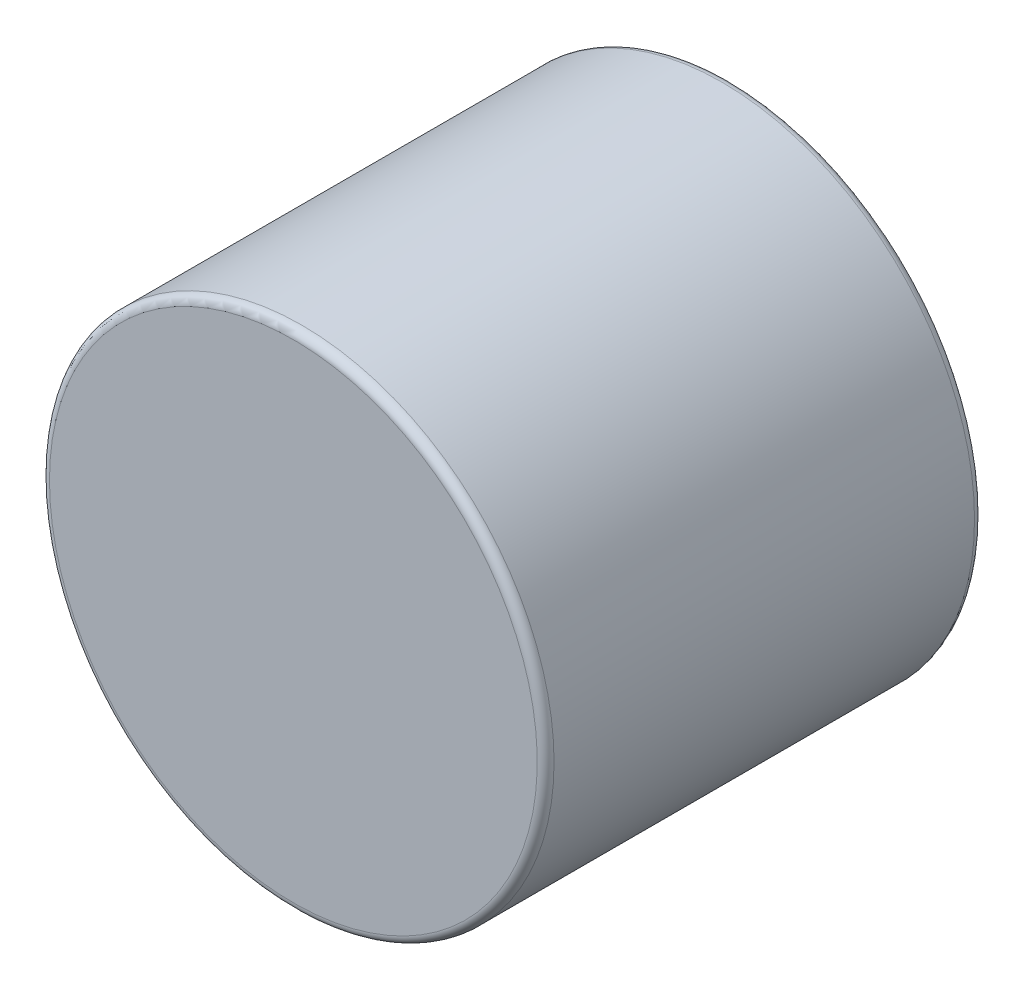
ISO-10303-21;
HEADER;
FILE_DESCRIPTION(('STEP AP214'),'2;1');
FILE_NAME('part.step','',(''),(''),'','','');
FILE_SCHEMA(('AUTOMOTIVE_DESIGN { 1 0 10303 214 1 1 1 1 }'));
ENDSEC;
DATA;
#1=APPLICATION_CONTEXT('core data for automotive mechanical design processes');
#2=APPLICATION_PROTOCOL_DEFINITION('international standard','automotive_design',2000,#1);
#3=PRODUCT_CONTEXT('',#1,'mechanical');
#4=PRODUCT('Part','Part','',(#3));
#5=PRODUCT_RELATED_PRODUCT_CATEGORY('part','',(#4));
#6=PRODUCT_DEFINITION_FORMATION('','',#4);
#7=PRODUCT_DEFINITION_CONTEXT('part definition',#1,'design');
#8=PRODUCT_DEFINITION('design','',#6,#7);
#9=PRODUCT_DEFINITION_SHAPE('','',#8);
#10=(LENGTH_UNIT() NAMED_UNIT(*) SI_UNIT(.MILLI.,.METRE.));
#11=(NAMED_UNIT(*) PLANE_ANGLE_UNIT() SI_UNIT($,.RADIAN.));
#12=(NAMED_UNIT(*) SI_UNIT($,.STERADIAN.) SOLID_ANGLE_UNIT());
#13=UNCERTAINTY_MEASURE_WITH_UNIT(LENGTH_MEASURE(1.E-05),#10,'distance_accuracy_value','');
#14=(GEOMETRIC_REPRESENTATION_CONTEXT(3) GLOBAL_UNCERTAINTY_ASSIGNED_CONTEXT((#13)) GLOBAL_UNIT_ASSIGNED_CONTEXT((#10,
#11,#12)) REPRESENTATION_CONTEXT('',''));
#15=CARTESIAN_POINT('',(0.,0.,0.));
#16=DIRECTION('',(0.,0.,1.));
#17=DIRECTION('',(1.,0.,0.));
#18=AXIS2_PLACEMENT_3D('',#15,#16,#17);
#19=CARTESIAN_POINT('',(228.6,-285.75,228.6));
#20=DIRECTION('',(-1.,0.,0.));
#21=DIRECTION('',(0.,0.,1.));
#22=AXIS2_PLACEMENT_3D('',#19,#20,#21);
#23=PLANE('',#22);
#24=DIRECTION('',(0.,0.,-1.));
#25=VECTOR('',#24,1.);
#26=CARTESIAN_POINT('',(228.6,-292.1,228.6));
#27=LINE('',#26,#25);
#28=CARTESIAN_POINT('',(228.6,-292.1,228.6));
#29=VERTEX_POINT('',#28);
#30=CARTESIAN_POINT('',(228.6,-292.1,-228.6));
#31=VERTEX_POINT('',#30);
#32=EDGE_CURVE('E109',#29,#31,#27,.T.);
#33=ORIENTED_EDGE('',*,*,#32,.T.);
#34=DIRECTION('',(0.,-1.,0.));
#35=VECTOR('',#34,1.);
#36=CARTESIAN_POINT('',(228.6,-285.75,-228.6));
#37=LINE('',#36,#35);
#38=CARTESIAN_POINT('',(228.6,-285.75,-228.6));
#39=VERTEX_POINT('',#38);
#40=EDGE_CURVE('E12',#39,#31,#37,.T.);
#41=ORIENTED_EDGE('',*,*,#40,.F.);
#42=DIRECTION('',(0.,0.,-1.));
#43=VECTOR('',#42,1.);
#44=CARTESIAN_POINT('',(228.6,-285.75,228.6));
#45=LINE('',#44,#43);
#46=CARTESIAN_POINT('',(228.6,-285.75,228.6));
#47=VERTEX_POINT('',#46);
#48=EDGE_CURVE('E97',#47,#39,#45,.T.);
#49=ORIENTED_EDGE('',*,*,#48,.F.);
#50=DIRECTION('',(0.,-1.,0.));
#51=VECTOR('',#50,1.);
#52=CARTESIAN_POINT('',(228.6,-285.75,228.6));
#53=LINE('',#52,#51);
#54=EDGE_CURVE('E105',#47,#29,#53,.T.);
#55=ORIENTED_EDGE('',*,*,#54,.T.);
#56=EDGE_LOOP('',(#33,#41,#49,#55));
#57=FACE_BOUND('',#56,.T.);
#58=ADVANCED_FACE('F46',(#57),#23,.F.);
#59=CARTESIAN_POINT('',(-228.6,-285.75,-228.6));
#60=DIRECTION('',(0.,0.,1.));
#61=DIRECTION('',(1.,0.,0.));
#62=AXIS2_PLACEMENT_3D('',#59,#60,#61);
#63=PLANE('',#62);
#64=DIRECTION('',(-1.,0.,0.));
#65=VECTOR('',#64,1.);
#66=CARTESIAN_POINT('',(-228.6,-292.1,-228.6));
#67=LINE('',#66,#65);
#68=CARTESIAN_POINT('',(-228.6,-292.1,-228.6));
#69=VERTEX_POINT('',#68);
#70=EDGE_CURVE('E101',#31,#69,#67,.T.);
#71=ORIENTED_EDGE('',*,*,#70,.T.);
#72=DIRECTION('',(0.,-1.,0.));
#73=VECTOR('',#72,1.);
#74=CARTESIAN_POINT('',(-228.6,-285.75,-228.6));
#75=LINE('',#74,#73);
#76=CARTESIAN_POINT('',(-228.6,-285.75,-228.6));
#77=VERTEX_POINT('',#76);
#78=EDGE_CURVE('E54',#77,#69,#75,.T.);
#79=ORIENTED_EDGE('',*,*,#78,.F.);
#80=DIRECTION('',(-1.,0.,0.));
#81=VECTOR('',#80,1.);
#82=CARTESIAN_POINT('',(-228.6,-285.75,-228.6));
#83=LINE('',#82,#81);
#84=EDGE_CURVE('E92',#39,#77,#83,.T.);
#85=ORIENTED_EDGE('',*,*,#84,.F.);
#86=ORIENTED_EDGE('',*,*,#40,.T.);
#87=EDGE_LOOP('',(#71,#79,#85,#86));
#88=FACE_BOUND('',#87,.T.);
#89=ADVANCED_FACE('F100',(#88),#63,.F.);
#90=CARTESIAN_POINT('',(-228.6,-285.75,228.6));
#91=DIRECTION('',(1.,0.,0.));
#92=DIRECTION('',(0.,0.,-1.));
#93=AXIS2_PLACEMENT_3D('',#90,#91,#92);
#94=PLANE('',#93);
#95=DIRECTION('',(0.,0.,1.));
#96=VECTOR('',#95,1.);
#97=CARTESIAN_POINT('',(-228.6,-292.1,228.6));
#98=LINE('',#97,#96);
#99=CARTESIAN_POINT('',(-228.6,-292.1,228.6));
#100=VERTEX_POINT('',#99);
#101=EDGE_CURVE('E79',#69,#100,#98,.T.);
#102=ORIENTED_EDGE('',*,*,#101,.T.);
#103=DIRECTION('',(0.,-1.,0.));
#104=VECTOR('',#103,1.);
#105=CARTESIAN_POINT('',(-228.6,-285.75,228.6));
#106=LINE('',#105,#104);
#107=CARTESIAN_POINT('',(-228.6,-285.75,228.6));
#108=VERTEX_POINT('',#107);
#109=EDGE_CURVE('E102',#108,#100,#106,.T.);
#110=ORIENTED_EDGE('',*,*,#109,.F.);
#111=DIRECTION('',(0.,0.,1.));
#112=VECTOR('',#111,1.);
#113=CARTESIAN_POINT('',(-228.6,-285.75,228.6));
#114=LINE('',#113,#112);
#115=EDGE_CURVE('E95',#77,#108,#114,.T.);
#116=ORIENTED_EDGE('',*,*,#115,.F.);
#117=ORIENTED_EDGE('',*,*,#78,.T.);
#118=EDGE_LOOP('',(#102,#110,#116,#117));
#119=FACE_BOUND('',#118,.T.);
#120=ADVANCED_FACE('F103',(#119),#94,.F.);
#121=CARTESIAN_POINT('',(-228.6,-285.75,228.6));
#122=DIRECTION('',(0.,0.,-1.));
#123=DIRECTION('',(-1.,0.,0.));
#124=AXIS2_PLACEMENT_3D('',#121,#122,#123);
#125=PLANE('',#124);
#126=DIRECTION('',(1.,0.,0.));
#127=VECTOR('',#126,1.);
#128=CARTESIAN_POINT('',(-228.6,-292.1,228.6));
#129=LINE('',#128,#127);
#130=EDGE_CURVE('E85',#100,#29,#129,.T.);
#131=ORIENTED_EDGE('',*,*,#130,.T.);
#132=ORIENTED_EDGE('',*,*,#54,.F.);
#133=DIRECTION('',(1.,0.,0.));
#134=VECTOR('',#133,1.);
#135=CARTESIAN_POINT('',(-228.6,-285.75,228.6));
#136=LINE('',#135,#134);
#137=EDGE_CURVE('E62',#108,#47,#136,.T.);
#138=ORIENTED_EDGE('',*,*,#137,.F.);
#139=ORIENTED_EDGE('',*,*,#109,.T.);
#140=EDGE_LOOP('',(#131,#132,#138,#139));
#141=FACE_BOUND('',#140,.T.);
#142=ADVANCED_FACE('F116',(#141),#125,.F.);
#143=CARTESIAN_POINT('',(228.6,-285.75,-228.6));
#144=DIRECTION('',(0.,-1.,0.));
#145=DIRECTION('',(0.,0.,-1.));
#146=AXIS2_PLACEMENT_3D('',#143,#144,#145);
#147=PLANE('',#146);
#148=ORIENTED_EDGE('',*,*,#48,.T.);
#149=ORIENTED_EDGE('',*,*,#84,.T.);
#150=ORIENTED_EDGE('',*,*,#115,.T.);
#151=ORIENTED_EDGE('',*,*,#137,.T.);
#152=EDGE_LOOP('',(#148,#149,#150,#151));
#153=FACE_BOUND('',#152,.T.);
#154=ADVANCED_FACE('F93',(#153),#147,.F.);
#155=CARTESIAN_POINT('',(228.6,-292.1,-228.6));
#156=DIRECTION('',(0.,-1.,0.));
#157=DIRECTION('',(0.,0.,-1.));
#158=AXIS2_PLACEMENT_3D('',#155,#156,#157);
#159=PLANE('',#158);
#160=ORIENTED_EDGE('',*,*,#32,.F.);
#161=ORIENTED_EDGE('',*,*,#130,.F.);
#162=ORIENTED_EDGE('',*,*,#101,.F.);
#163=ORIENTED_EDGE('',*,*,#70,.F.);
#164=EDGE_LOOP('',(#160,#161,#162,#163));
#165=FACE_BOUND('',#164,.T.);
#166=ADVANCED_FACE('F119',(#165),#159,.T.);
#167=CLOSED_SHELL('',(#58,#89,#120,#142,#154,#166));
#168=MANIFOLD_SOLID_BREP('B2',#167);
#169=CARTESIAN_POINT('',(254.,222.25,254.));
#170=DIRECTION('',(-1.,0.,0.));
#171=DIRECTION('',(0.,0.,1.));
#172=AXIS2_PLACEMENT_3D('',#169,#170,#171);
#173=PLANE('',#172);
#174=DIRECTION('',(0.,0.,-1.));
#175=VECTOR('',#174,1.);
#176=CARTESIAN_POINT('',(254.,215.9,254.));
#177=LINE('',#176,#175);
#178=CARTESIAN_POINT('',(254.,215.9,254.));
#179=VERTEX_POINT('',#178);
#180=CARTESIAN_POINT('',(254.,215.9,-254.));
#181=VERTEX_POINT('',#180);
#182=EDGE_CURVE('E240',#179,#181,#177,.T.);
#183=ORIENTED_EDGE('',*,*,#182,.T.);
#184=DIRECTION('',(0.,-1.,0.));
#185=VECTOR('',#184,1.);
#186=CARTESIAN_POINT('',(254.,222.25,-254.));
#187=LINE('',#186,#185);
#188=CARTESIAN_POINT('',(254.,222.25,-254.));
#189=VERTEX_POINT('',#188);
#190=EDGE_CURVE('E44',#189,#181,#187,.T.);
#191=ORIENTED_EDGE('',*,*,#190,.F.);
#192=DIRECTION('',(0.,0.,-1.));
#193=VECTOR('',#192,1.);
#194=CARTESIAN_POINT('',(254.,222.25,254.));
#195=LINE('',#194,#193);
#196=CARTESIAN_POINT('',(254.,222.25,254.));
#197=VERTEX_POINT('',#196);
#198=EDGE_CURVE('E228',#197,#189,#195,.T.);
#199=ORIENTED_EDGE('',*,*,#198,.F.);
#200=DIRECTION('',(0.,-1.,0.));
#201=VECTOR('',#200,1.);
#202=CARTESIAN_POINT('',(254.,222.25,254.));
#203=LINE('',#202,#201);
#204=EDGE_CURVE('E236',#197,#179,#203,.T.);
#205=ORIENTED_EDGE('',*,*,#204,.T.);
#206=EDGE_LOOP('',(#183,#191,#199,#205));
#207=FACE_BOUND('',#206,.T.);
#208=ADVANCED_FACE('F177',(#207),#173,.F.);
#209=CARTESIAN_POINT('',(-254.,222.25,-254.));
#210=DIRECTION('',(0.,0.,1.));
#211=DIRECTION('',(1.,0.,0.));
#212=AXIS2_PLACEMENT_3D('',#209,#210,#211);
#213=PLANE('',#212);
#214=DIRECTION('',(-1.,0.,0.));
#215=VECTOR('',#214,1.);
#216=CARTESIAN_POINT('',(-254.,215.9,-254.));
#217=LINE('',#216,#215);
#218=CARTESIAN_POINT('',(-254.,215.9,-254.));
#219=VERTEX_POINT('',#218);
#220=EDGE_CURVE('E232',#181,#219,#217,.T.);
#221=ORIENTED_EDGE('',*,*,#220,.T.);
#222=DIRECTION('',(0.,-1.,0.));
#223=VECTOR('',#222,1.);
#224=CARTESIAN_POINT('',(-254.,222.25,-254.));
#225=LINE('',#224,#223);
#226=CARTESIAN_POINT('',(-254.,222.25,-254.));
#227=VERTEX_POINT('',#226);
#228=EDGE_CURVE('E185',#227,#219,#225,.T.);
#229=ORIENTED_EDGE('',*,*,#228,.F.);
#230=DIRECTION('',(-1.,0.,0.));
#231=VECTOR('',#230,1.);
#232=CARTESIAN_POINT('',(-254.,222.25,-254.));
#233=LINE('',#232,#231);
#234=EDGE_CURVE('E223',#189,#227,#233,.T.);
#235=ORIENTED_EDGE('',*,*,#234,.F.);
#236=ORIENTED_EDGE('',*,*,#190,.T.);
#237=EDGE_LOOP('',(#221,#229,#235,#236));
#238=FACE_BOUND('',#237,.T.);
#239=ADVANCED_FACE('F231',(#238),#213,.F.);
#240=CARTESIAN_POINT('',(-254.,222.25,254.));
#241=DIRECTION('',(1.,0.,0.));
#242=DIRECTION('',(0.,0.,-1.));
#243=AXIS2_PLACEMENT_3D('',#240,#241,#242);
#244=PLANE('',#243);
#245=DIRECTION('',(0.,0.,1.));
#246=VECTOR('',#245,1.);
#247=CARTESIAN_POINT('',(-254.,215.9,254.));
#248=LINE('',#247,#246);
#249=CARTESIAN_POINT('',(-254.,215.9,254.));
#250=VERTEX_POINT('',#249);
#251=EDGE_CURVE('E210',#219,#250,#248,.T.);
#252=ORIENTED_EDGE('',*,*,#251,.T.);
#253=DIRECTION('',(0.,-1.,0.));
#254=VECTOR('',#253,1.);
#255=CARTESIAN_POINT('',(-254.,222.25,254.));
#256=LINE('',#255,#254);
#257=CARTESIAN_POINT('',(-254.,222.25,254.));
#258=VERTEX_POINT('',#257);
#259=EDGE_CURVE('E233',#258,#250,#256,.T.);
#260=ORIENTED_EDGE('',*,*,#259,.F.);
#261=DIRECTION('',(0.,0.,1.));
#262=VECTOR('',#261,1.);
#263=CARTESIAN_POINT('',(-254.,222.25,254.));
#264=LINE('',#263,#262);
#265=EDGE_CURVE('E226',#227,#258,#264,.T.);
#266=ORIENTED_EDGE('',*,*,#265,.F.);
#267=ORIENTED_EDGE('',*,*,#228,.T.);
#268=EDGE_LOOP('',(#252,#260,#266,#267));
#269=FACE_BOUND('',#268,.T.);
#270=ADVANCED_FACE('F234',(#269),#244,.F.);
#271=CARTESIAN_POINT('',(-254.,222.25,254.));
#272=DIRECTION('',(0.,0.,-1.));
#273=DIRECTION('',(-1.,0.,0.));
#274=AXIS2_PLACEMENT_3D('',#271,#272,#273);
#275=PLANE('',#274);
#276=DIRECTION('',(1.,0.,0.));
#277=VECTOR('',#276,1.);
#278=CARTESIAN_POINT('',(-254.,215.9,254.));
#279=LINE('',#278,#277);
#280=EDGE_CURVE('E216',#250,#179,#279,.T.);
#281=ORIENTED_EDGE('',*,*,#280,.T.);
#282=ORIENTED_EDGE('',*,*,#204,.F.);
#283=DIRECTION('',(1.,0.,0.));
#284=VECTOR('',#283,1.);
#285=CARTESIAN_POINT('',(-254.,222.25,254.));
#286=LINE('',#285,#284);
#287=EDGE_CURVE('E193',#258,#197,#286,.T.);
#288=ORIENTED_EDGE('',*,*,#287,.F.);
#289=ORIENTED_EDGE('',*,*,#259,.T.);
#290=EDGE_LOOP('',(#281,#282,#288,#289));
#291=FACE_BOUND('',#290,.T.);
#292=ADVANCED_FACE('F247',(#291),#275,.F.);
#293=CARTESIAN_POINT('',(254.,222.25,-254.));
#294=DIRECTION('',(0.,-1.,0.));
#295=DIRECTION('',(0.,0.,-1.));
#296=AXIS2_PLACEMENT_3D('',#293,#294,#295);
#297=PLANE('',#296);
#298=ORIENTED_EDGE('',*,*,#198,.T.);
#299=ORIENTED_EDGE('',*,*,#234,.T.);
#300=ORIENTED_EDGE('',*,*,#265,.T.);
#301=ORIENTED_EDGE('',*,*,#287,.T.);
#302=EDGE_LOOP('',(#298,#299,#300,#301));
#303=FACE_BOUND('',#302,.T.);
#304=ADVANCED_FACE('F224',(#303),#297,.F.);
#305=CARTESIAN_POINT('',(254.,215.9,-254.));
#306=DIRECTION('',(0.,-1.,0.));
#307=DIRECTION('',(0.,0.,-1.));
#308=AXIS2_PLACEMENT_3D('',#305,#306,#307);
#309=PLANE('',#308);
#310=ORIENTED_EDGE('',*,*,#182,.F.);
#311=ORIENTED_EDGE('',*,*,#280,.F.);
#312=ORIENTED_EDGE('',*,*,#251,.F.);
#313=ORIENTED_EDGE('',*,*,#220,.F.);
#314=EDGE_LOOP('',(#310,#311,#312,#313));
#315=FACE_BOUND('',#314,.T.);
#316=ADVANCED_FACE('F250',(#315),#309,.T.);
#317=CLOSED_SHELL('',(#208,#239,#270,#292,#304,#316));
#318=MANIFOLD_SOLID_BREP('B6',#317);
#319=CARTESIAN_POINT('',(0.,381.,-330.2));
#320=DIRECTION('',(0.,0.,1.));
#321=DIRECTION('',(1.,0.,0.));
#322=AXIS2_PLACEMENT_3D('',#319,#320,#321);
#323=PLANE('',#322);
#324=CARTESIAN_POINT('',(0.,0.,-330.2));
#325=DIRECTION('',(0.,0.,1.));
#326=DIRECTION('',(1.,0.,0.));
#327=AXIS2_PLACEMENT_3D('',#324,#325,#326);
#328=CIRCLE('',#327,368.3);
#329=CARTESIAN_POINT('',(368.3,0.,-330.2));
#330=VERTEX_POINT('',#329);
#331=EDGE_CURVE('E176',#330,#330,#328,.F.);
#332=ORIENTED_EDGE('',*,*,#331,.T.);
#333=EDGE_LOOP('',(#332));
#334=FACE_BOUND('',#333,.T.);
#335=ADVANCED_FACE('F301',(#334),#323,.F.);
#336=CARTESIAN_POINT('',(0.,0.,330.2));
#337=DIRECTION('',(0.,0.,1.));
#338=DIRECTION('',(1.,0.,0.));
#339=AXIS2_PLACEMENT_3D('',#336,#337,#338);
#340=CYLINDRICAL_SURFACE('',#339,381.);
#341=CARTESIAN_POINT('',(0.,0.,317.5));
#342=DIRECTION('',(0.,0.,-1.));
#343=DIRECTION('',(-1.,0.,0.));
#344=AXIS2_PLACEMENT_3D('',#341,#342,#343);
#345=CIRCLE('',#344,381.);
#346=CARTESIAN_POINT('',(-381.,0.,317.5));
#347=VERTEX_POINT('',#346);
#348=EDGE_CURVE('E309',#347,#347,#345,.T.);
#349=ORIENTED_EDGE('',*,*,#348,.T.);
#350=EDGE_LOOP('',(#349));
#351=FACE_BOUND('',#350,.T.);
#352=CARTESIAN_POINT('',(0.,0.,-317.5));
#353=DIRECTION('',(0.,0.,1.));
#354=DIRECTION('',(1.,0.,0.));
#355=AXIS2_PLACEMENT_3D('',#352,#353,#354);
#356=CIRCLE('',#355,381.);
#357=CARTESIAN_POINT('',(381.,0.,-317.5));
#358=VERTEX_POINT('',#357);
#359=EDGE_CURVE('E313',#358,#358,#356,.T.);
#360=ORIENTED_EDGE('',*,*,#359,.T.);
#361=EDGE_LOOP('',(#360));
#362=FACE_BOUND('',#361,.T.);
#363=ADVANCED_FACE('F353',(#351,#362),#340,.T.);
#364=CARTESIAN_POINT('',(0.,0.,330.2));
#365=DIRECTION('',(0.,0.,-1.));
#366=DIRECTION('',(-1.,0.,0.));
#367=AXIS2_PLACEMENT_3D('',#364,#365,#366);
#368=PLANE('',#367);
#369=CARTESIAN_POINT('',(0.,0.,330.2));
#370=DIRECTION('',(0.,0.,-1.));
#371=DIRECTION('',(-1.,0.,0.));
#372=AXIS2_PLACEMENT_3D('',#369,#370,#371);
#373=CIRCLE('',#372,368.3);
#374=CARTESIAN_POINT('',(-368.3,0.,330.2));
#375=VERTEX_POINT('',#374);
#376=EDGE_CURVE('E317',#375,#375,#373,.F.);
#377=ORIENTED_EDGE('',*,*,#376,.T.);
#378=EDGE_LOOP('',(#377));
#379=FACE_BOUND('',#378,.T.);
#380=ADVANCED_FACE('F347',(#379),#368,.F.);
#381=CARTESIAN_POINT('',(0.,0.,317.5));
#382=DIRECTION('',(0.,0.,-1.));
#383=DIRECTION('',(-1.,0.,0.));
#384=AXIS2_PLACEMENT_3D('',#381,#382,#383);
#385=TOROIDAL_SURFACE('',#384,368.3,12.7);
#386=ORIENTED_EDGE('',*,*,#348,.F.);
#387=EDGE_LOOP('',(#386));
#388=FACE_BOUND('',#387,.T.);
#389=ORIENTED_EDGE('',*,*,#376,.F.);
#390=EDGE_LOOP('',(#389));
#391=FACE_BOUND('',#390,.T.);
#392=ADVANCED_FACE('F345',(#388,#391),#385,.T.);
#393=CARTESIAN_POINT('',(0.,0.,-317.5));
#394=DIRECTION('',(0.,0.,1.));
#395=DIRECTION('',(1.,0.,0.));
#396=AXIS2_PLACEMENT_3D('',#393,#394,#395);
#397=TOROIDAL_SURFACE('',#396,368.3,12.7);
#398=ORIENTED_EDGE('',*,*,#331,.F.);
#399=EDGE_LOOP('',(#398));
#400=FACE_BOUND('',#399,.T.);
#401=ORIENTED_EDGE('',*,*,#359,.F.);
#402=EDGE_LOOP('',(#401));
#403=FACE_BOUND('',#402,.T.);
#404=ADVANCED_FACE('F303',(#400,#403),#397,.T.);
#405=CLOSED_SHELL('',(#335,#363,#380,#392,#404));
#406=CARTESIAN_POINT('',(0.,0.,325.12));
#407=DIRECTION('',(0.,0.,1.));
#408=DIRECTION('',(1.,0.,0.));
#409=AXIS2_PLACEMENT_3D('',#406,#407,#408);
#410=PLANE('',#409);
#411=CARTESIAN_POINT('',(0.,0.,325.12));
#412=DIRECTION('',(0.,0.,1.));
#413=DIRECTION('',(1.,0.,0.));
#414=AXIS2_PLACEMENT_3D('',#411,#412,#413);
#415=CIRCLE('',#414,375.92);
#416=CARTESIAN_POINT('',(375.92,0.,325.12));
#417=VERTEX_POINT('',#416);
#418=EDGE_CURVE('E322',#417,#417,#415,.T.);
#419=ORIENTED_EDGE('',*,*,#418,.F.);
#420=EDGE_LOOP('',(#419));
#421=FACE_BOUND('',#420,.T.);
#422=ADVANCED_FACE('F334',(#421),#410,.F.);
#423=CARTESIAN_POINT('',(0.,0.,330.2));
#424=DIRECTION('',(0.,0.,1.));
#425=DIRECTION('',(1.,0.,0.));
#426=AXIS2_PLACEMENT_3D('',#423,#424,#425);
#427=CYLINDRICAL_SURFACE('',#426,375.92);
#428=CARTESIAN_POINT('',(0.,0.,-325.12));
#429=DIRECTION('',(0.,0.,1.));
#430=DIRECTION('',(1.,0.,0.));
#431=AXIS2_PLACEMENT_3D('',#428,#429,#430);
#432=CIRCLE('',#431,375.92);
#433=CARTESIAN_POINT('',(375.92,0.,-325.12));
#434=VERTEX_POINT('',#433);
#435=EDGE_CURVE('E325',#434,#434,#432,.T.);
#436=ORIENTED_EDGE('',*,*,#435,.F.);
#437=EDGE_LOOP('',(#436));
#438=FACE_BOUND('',#437,.T.);
#439=ORIENTED_EDGE('',*,*,#418,.T.);
#440=EDGE_LOOP('',(#439));
#441=FACE_BOUND('',#440,.T.);
#442=ADVANCED_FACE('F331',(#438,#441),#427,.F.);
#443=CARTESIAN_POINT('',(0.,375.92,-325.12));
#444=DIRECTION('',(0.,0.,-1.));
#445=DIRECTION('',(-1.,0.,0.));
#446=AXIS2_PLACEMENT_3D('',#443,#444,#445);
#447=PLANE('',#446);
#448=ORIENTED_EDGE('',*,*,#435,.T.);
#449=EDGE_LOOP('',(#448));
#450=FACE_BOUND('',#449,.T.);
#451=ADVANCED_FACE('F329',(#450),#447,.F.);
#452=CLOSED_SHELL('',(#422,#442,#451));
#453=ORIENTED_CLOSED_SHELL('',*,#452,.T.);
#454=BREP_WITH_VOIDS('B38',#405,(#453));
#455=ADVANCED_BREP_SHAPE_REPRESENTATION('',(#18,#168,#318,#454),#14);
#456=SHAPE_DEFINITION_REPRESENTATION(#9,#455);
ENDSEC;
END-ISO-10303-21;
